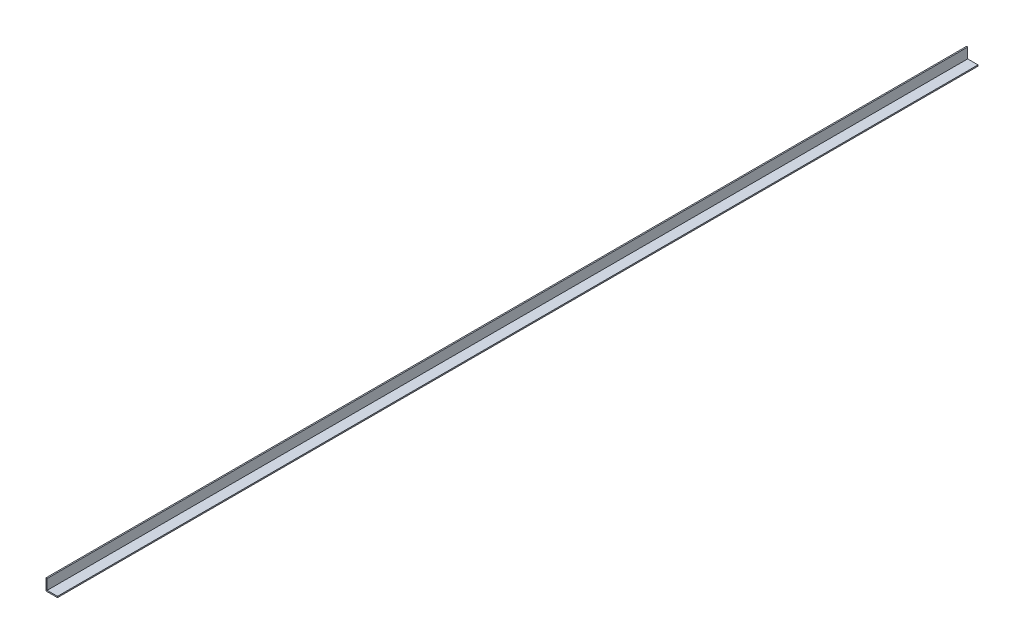
ISO-10303-21;
HEADER;
FILE_DESCRIPTION(('STEP AP214'),'2;1');
FILE_NAME('part.step','',(''),(''),'','','');
FILE_SCHEMA(('AUTOMOTIVE_DESIGN { 1 0 10303 214 1 1 1 1 }'));
ENDSEC;
DATA;
#1=APPLICATION_CONTEXT('core data for automotive mechanical design processes');
#2=APPLICATION_PROTOCOL_DEFINITION('international standard','automotive_design',2000,#1);
#3=PRODUCT_CONTEXT('',#1,'mechanical');
#4=PRODUCT('Part','Part','',(#3));
#5=PRODUCT_RELATED_PRODUCT_CATEGORY('part','',(#4));
#6=PRODUCT_DEFINITION_FORMATION('','',#4);
#7=PRODUCT_DEFINITION_CONTEXT('part definition',#1,'design');
#8=PRODUCT_DEFINITION('design','',#6,#7);
#9=PRODUCT_DEFINITION_SHAPE('','',#8);
#10=(LENGTH_UNIT() NAMED_UNIT(*) SI_UNIT(.MILLI.,.METRE.));
#11=(NAMED_UNIT(*) PLANE_ANGLE_UNIT() SI_UNIT($,.RADIAN.));
#12=(NAMED_UNIT(*) SI_UNIT($,.STERADIAN.) SOLID_ANGLE_UNIT());
#13=UNCERTAINTY_MEASURE_WITH_UNIT(LENGTH_MEASURE(1.E-05),#10,'distance_accuracy_value','');
#14=(GEOMETRIC_REPRESENTATION_CONTEXT(3) GLOBAL_UNCERTAINTY_ASSIGNED_CONTEXT((#13)) GLOBAL_UNIT_ASSIGNED_CONTEXT((#10,
#11,#12)) REPRESENTATION_CONTEXT('',''));
#15=CARTESIAN_POINT('',(0.,0.,0.));
#16=DIRECTION('',(0.,0.,1.));
#17=DIRECTION('',(1.,0.,0.));
#18=AXIS2_PLACEMENT_3D('',#15,#16,#17);
#19=CARTESIAN_POINT('',(7.94,76.2,-6100.));
#20=DIRECTION('',(0.,1.,0.));
#21=DIRECTION('',(0.,0.,1.));
#22=AXIS2_PLACEMENT_3D('',#19,#20,#21);
#23=PLANE('',#22);
#24=DIRECTION('',(-1.,0.,0.));
#25=VECTOR('',#24,1.);
#26=CARTESIAN_POINT('',(7.94,76.2,0.));
#27=LINE('',#26,#25);
#28=CARTESIAN_POINT('',(7.94,76.2,0.));
#29=VERTEX_POINT('',#28);
#30=CARTESIAN_POINT('',(0.,76.2,0.));
#31=VERTEX_POINT('',#30);
#32=EDGE_CURVE('E118',#29,#31,#27,.T.);
#33=ORIENTED_EDGE('',*,*,#32,.F.);
#34=DIRECTION('',(0.,0.,1.));
#35=VECTOR('',#34,1.);
#36=CARTESIAN_POINT('',(7.94,76.2,-6100.));
#37=LINE('',#36,#35);
#38=CARTESIAN_POINT('',(7.94,76.2,-6100.));
#39=VERTEX_POINT('',#38);
#40=EDGE_CURVE('E11',#39,#29,#37,.T.);
#41=ORIENTED_EDGE('',*,*,#40,.F.);
#42=DIRECTION('',(-1.,0.,0.));
#43=VECTOR('',#42,1.);
#44=CARTESIAN_POINT('',(7.94,76.2,-6100.));
#45=LINE('',#44,#43);
#46=CARTESIAN_POINT('',(0.,76.2,-6100.));
#47=VERTEX_POINT('',#46);
#48=EDGE_CURVE('E132',#39,#47,#45,.T.);
#49=ORIENTED_EDGE('',*,*,#48,.T.);
#50=DIRECTION('',(0.,0.,1.));
#51=VECTOR('',#50,1.);
#52=CARTESIAN_POINT('',(0.,76.2,-6100.));
#53=LINE('',#52,#51);
#54=EDGE_CURVE('E36',#47,#31,#53,.T.);
#55=ORIENTED_EDGE('',*,*,#54,.T.);
#56=EDGE_LOOP('',(#33,#41,#49,#55));
#57=FACE_BOUND('',#56,.T.);
#58=ADVANCED_FACE('F33',(#57),#23,.T.);
#59=CARTESIAN_POINT('',(7.94,7.94,-6100.));
#60=DIRECTION('',(1.,0.,0.));
#61=DIRECTION('',(0.,1.,0.));
#62=AXIS2_PLACEMENT_3D('',#59,#60,#61);
#63=PLANE('',#62);
#64=DIRECTION('',(0.,1.,0.));
#65=VECTOR('',#64,1.);
#66=CARTESIAN_POINT('',(7.94,7.94,0.));
#67=LINE('',#66,#65);
#68=CARTESIAN_POINT('',(7.94,7.94,0.));
#69=VERTEX_POINT('',#68);
#70=EDGE_CURVE('E130',#69,#29,#67,.T.);
#71=ORIENTED_EDGE('',*,*,#70,.F.);
#72=DIRECTION('',(0.,0.,1.));
#73=VECTOR('',#72,1.);
#74=CARTESIAN_POINT('',(7.94,7.94,-6100.));
#75=LINE('',#74,#73);
#76=CARTESIAN_POINT('',(7.94,7.94,-6100.));
#77=VERTEX_POINT('',#76);
#78=EDGE_CURVE('E42',#77,#69,#75,.T.);
#79=ORIENTED_EDGE('',*,*,#78,.F.);
#80=DIRECTION('',(0.,1.,0.));
#81=VECTOR('',#80,1.);
#82=CARTESIAN_POINT('',(7.94,7.94,-6100.));
#83=LINE('',#82,#81);
#84=EDGE_CURVE('E108',#77,#39,#83,.T.);
#85=ORIENTED_EDGE('',*,*,#84,.T.);
#86=ORIENTED_EDGE('',*,*,#40,.T.);
#87=EDGE_LOOP('',(#71,#79,#85,#86));
#88=FACE_BOUND('',#87,.T.);
#89=ADVANCED_FACE('F140',(#88),#63,.T.);
#90=CARTESIAN_POINT('',(76.2,7.94,-6100.));
#91=DIRECTION('',(0.,1.,0.));
#92=DIRECTION('',(-1.,0.,0.));
#93=AXIS2_PLACEMENT_3D('',#90,#91,#92);
#94=PLANE('',#93);
#95=DIRECTION('',(-1.,0.,0.));
#96=VECTOR('',#95,1.);
#97=CARTESIAN_POINT('',(76.2,7.94,0.));
#98=LINE('',#97,#96);
#99=CARTESIAN_POINT('',(76.2,7.94,0.));
#100=VERTEX_POINT('',#99);
#101=EDGE_CURVE('E95',#100,#69,#98,.T.);
#102=ORIENTED_EDGE('',*,*,#101,.F.);
#103=DIRECTION('',(0.,0.,1.));
#104=VECTOR('',#103,1.);
#105=CARTESIAN_POINT('',(76.2,7.94,-6100.));
#106=LINE('',#105,#104);
#107=CARTESIAN_POINT('',(76.2,7.94,-6100.));
#108=VERTEX_POINT('',#107);
#109=EDGE_CURVE('E90',#108,#100,#106,.T.);
#110=ORIENTED_EDGE('',*,*,#109,.F.);
#111=DIRECTION('',(-1.,0.,0.));
#112=VECTOR('',#111,1.);
#113=CARTESIAN_POINT('',(76.2,7.94,-6100.));
#114=LINE('',#113,#112);
#115=EDGE_CURVE('E93',#108,#77,#114,.T.);
#116=ORIENTED_EDGE('',*,*,#115,.T.);
#117=ORIENTED_EDGE('',*,*,#78,.T.);
#118=EDGE_LOOP('',(#102,#110,#116,#117));
#119=FACE_BOUND('',#118,.T.);
#120=ADVANCED_FACE('F92',(#119),#94,.T.);
#121=CARTESIAN_POINT('',(76.2,0.,-6100.));
#122=DIRECTION('',(1.,0.,0.));
#123=DIRECTION('',(0.,0.,-1.));
#124=AXIS2_PLACEMENT_3D('',#121,#122,#123);
#125=PLANE('',#124);
#126=DIRECTION('',(0.,1.,0.));
#127=VECTOR('',#126,1.);
#128=CARTESIAN_POINT('',(76.2,0.,0.));
#129=LINE('',#128,#127);
#130=CARTESIAN_POINT('',(76.2,0.,0.));
#131=VERTEX_POINT('',#130);
#132=EDGE_CURVE('E127',#131,#100,#129,.T.);
#133=ORIENTED_EDGE('',*,*,#132,.F.);
#134=DIRECTION('',(0.,0.,1.));
#135=VECTOR('',#134,1.);
#136=CARTESIAN_POINT('',(76.2,0.,-6100.));
#137=LINE('',#136,#135);
#138=CARTESIAN_POINT('',(76.2,0.,-6100.));
#139=VERTEX_POINT('',#138);
#140=EDGE_CURVE('E100',#139,#131,#137,.T.);
#141=ORIENTED_EDGE('',*,*,#140,.F.);
#142=DIRECTION('',(0.,1.,0.));
#143=VECTOR('',#142,1.);
#144=CARTESIAN_POINT('',(76.2,0.,-6100.));
#145=LINE('',#144,#143);
#146=EDGE_CURVE('E106',#139,#108,#145,.T.);
#147=ORIENTED_EDGE('',*,*,#146,.T.);
#148=ORIENTED_EDGE('',*,*,#109,.T.);
#149=EDGE_LOOP('',(#133,#141,#147,#148));
#150=FACE_BOUND('',#149,.T.);
#151=ADVANCED_FACE('F110',(#150),#125,.T.);
#152=CARTESIAN_POINT('',(0.,0.,-6100.));
#153=DIRECTION('',(0.,-1.,0.));
#154=DIRECTION('',(0.,0.,-1.));
#155=AXIS2_PLACEMENT_3D('',#152,#153,#154);
#156=PLANE('',#155);
#157=DIRECTION('',(1.,0.,0.));
#158=VECTOR('',#157,1.);
#159=CARTESIAN_POINT('',(0.,0.,0.));
#160=LINE('',#159,#158);
#161=CARTESIAN_POINT('',(0.,0.,0.));
#162=VERTEX_POINT('',#161);
#163=EDGE_CURVE('E124',#162,#131,#160,.T.);
#164=ORIENTED_EDGE('',*,*,#163,.F.);
#165=DIRECTION('',(0.,0.,1.));
#166=VECTOR('',#165,1.);
#167=CARTESIAN_POINT('',(0.,0.,-6100.));
#168=LINE('',#167,#166);
#169=CARTESIAN_POINT('',(0.,0.,-6100.));
#170=VERTEX_POINT('',#169);
#171=EDGE_CURVE('E135',#170,#162,#168,.T.);
#172=ORIENTED_EDGE('',*,*,#171,.F.);
#173=DIRECTION('',(1.,0.,0.));
#174=VECTOR('',#173,1.);
#175=CARTESIAN_POINT('',(0.,0.,-6100.));
#176=LINE('',#175,#174);
#177=EDGE_CURVE('E111',#170,#139,#176,.T.);
#178=ORIENTED_EDGE('',*,*,#177,.T.);
#179=ORIENTED_EDGE('',*,*,#140,.T.);
#180=EDGE_LOOP('',(#164,#172,#178,#179));
#181=FACE_BOUND('',#180,.T.);
#182=ADVANCED_FACE('F153',(#181),#156,.T.);
#183=CARTESIAN_POINT('',(0.,76.2,-6100.));
#184=DIRECTION('',(-1.,0.,0.));
#185=DIRECTION('',(0.,-1.,0.));
#186=AXIS2_PLACEMENT_3D('',#183,#184,#185);
#187=PLANE('',#186);
#188=DIRECTION('',(0.,-1.,0.));
#189=VECTOR('',#188,1.);
#190=CARTESIAN_POINT('',(0.,76.2,0.));
#191=LINE('',#190,#189);
#192=EDGE_CURVE('E121',#31,#162,#191,.T.);
#193=ORIENTED_EDGE('',*,*,#192,.F.);
#194=ORIENTED_EDGE('',*,*,#54,.F.);
#195=DIRECTION('',(0.,-1.,0.));
#196=VECTOR('',#195,1.);
#197=CARTESIAN_POINT('',(0.,76.2,-6100.));
#198=LINE('',#197,#196);
#199=EDGE_CURVE('E113',#47,#170,#198,.T.);
#200=ORIENTED_EDGE('',*,*,#199,.T.);
#201=ORIENTED_EDGE('',*,*,#171,.T.);
#202=EDGE_LOOP('',(#193,#194,#200,#201));
#203=FACE_BOUND('',#202,.T.);
#204=ADVANCED_FACE('F137',(#203),#187,.T.);
#205=CARTESIAN_POINT('',(0.,0.,-6100.));
#206=DIRECTION('',(0.,0.,1.));
#207=DIRECTION('',(1.,0.,0.));
#208=AXIS2_PLACEMENT_3D('',#205,#206,#207);
#209=PLANE('',#208);
#210=ORIENTED_EDGE('',*,*,#48,.F.);
#211=ORIENTED_EDGE('',*,*,#84,.F.);
#212=ORIENTED_EDGE('',*,*,#115,.F.);
#213=ORIENTED_EDGE('',*,*,#146,.F.);
#214=ORIENTED_EDGE('',*,*,#177,.F.);
#215=ORIENTED_EDGE('',*,*,#199,.F.);
#216=EDGE_LOOP('',(#210,#211,#212,#213,#214,#215));
#217=FACE_BOUND('',#216,.T.);
#218=ADVANCED_FACE('F104',(#217),#209,.F.);
#219=CARTESIAN_POINT('',(0.,0.,0.));
#220=DIRECTION('',(0.,0.,1.));
#221=DIRECTION('',(1.,0.,0.));
#222=AXIS2_PLACEMENT_3D('',#219,#220,#221);
#223=PLANE('',#222);
#224=ORIENTED_EDGE('',*,*,#32,.T.);
#225=ORIENTED_EDGE('',*,*,#192,.T.);
#226=ORIENTED_EDGE('',*,*,#163,.T.);
#227=ORIENTED_EDGE('',*,*,#132,.T.);
#228=ORIENTED_EDGE('',*,*,#101,.T.);
#229=ORIENTED_EDGE('',*,*,#70,.T.);
#230=EDGE_LOOP('',(#224,#225,#226,#227,#228,#229));
#231=FACE_BOUND('',#230,.T.);
#232=ADVANCED_FACE('F139',(#231),#223,.T.);
#233=CLOSED_SHELL('',(#58,#89,#120,#151,#182,#204,#218,#232));
#234=MANIFOLD_SOLID_BREP('B2',#233);
#235=ADVANCED_BREP_SHAPE_REPRESENTATION('',(#18,#234),#14);
#236=SHAPE_DEFINITION_REPRESENTATION(#9,#235);
ENDSEC;
END-ISO-10303-21;
